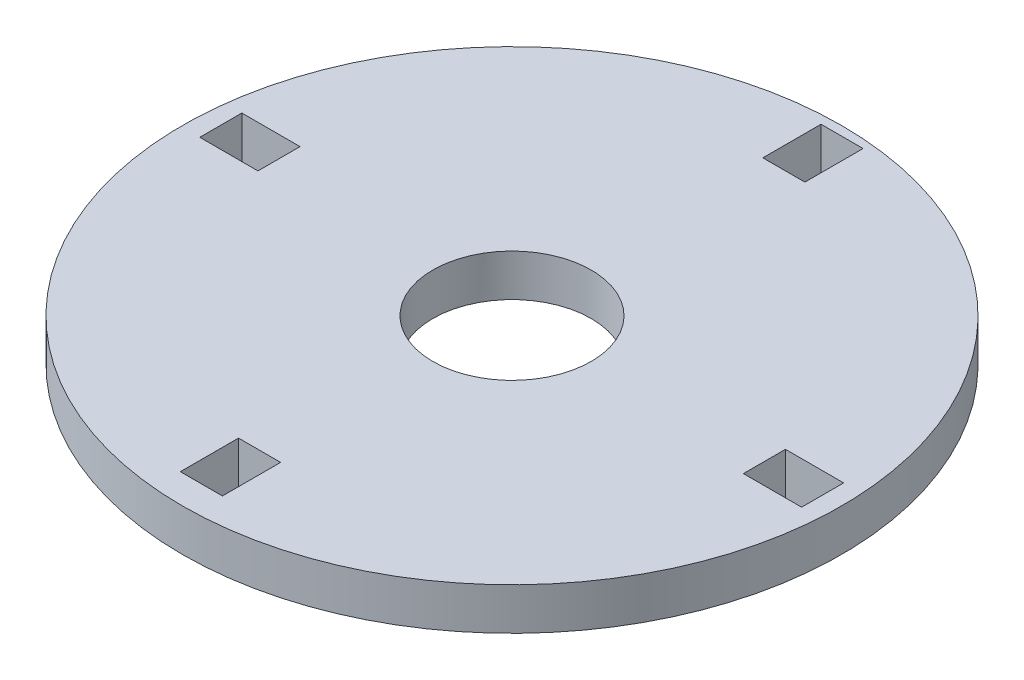
ISO-10303-21;
HEADER;
FILE_DESCRIPTION(('STEP AP214'),'2;1');
FILE_NAME('part.step','',(''),(''),'','','');
FILE_SCHEMA(('AUTOMOTIVE_DESIGN { 1 0 10303 214 1 1 1 1 }'));
ENDSEC;
DATA;
#1=APPLICATION_CONTEXT('core data for automotive mechanical design processes');
#2=APPLICATION_PROTOCOL_DEFINITION('international standard','automotive_design',2000,#1);
#3=PRODUCT_CONTEXT('',#1,'mechanical');
#4=PRODUCT('Part','Part','',(#3));
#5=PRODUCT_RELATED_PRODUCT_CATEGORY('part','',(#4));
#6=PRODUCT_DEFINITION_FORMATION('','',#4);
#7=PRODUCT_DEFINITION_CONTEXT('part definition',#1,'design');
#8=PRODUCT_DEFINITION('design','',#6,#7);
#9=PRODUCT_DEFINITION_SHAPE('','',#8);
#10=(LENGTH_UNIT() NAMED_UNIT(*) SI_UNIT(.MILLI.,.METRE.));
#11=(NAMED_UNIT(*) PLANE_ANGLE_UNIT() SI_UNIT($,.RADIAN.));
#12=(NAMED_UNIT(*) SI_UNIT($,.STERADIAN.) SOLID_ANGLE_UNIT());
#13=UNCERTAINTY_MEASURE_WITH_UNIT(LENGTH_MEASURE(1.E-05),#10,'distance_accuracy_value','');
#14=(GEOMETRIC_REPRESENTATION_CONTEXT(3) GLOBAL_UNCERTAINTY_ASSIGNED_CONTEXT((#13)) GLOBAL_UNIT_ASSIGNED_CONTEXT((#10,
#11,#12)) REPRESENTATION_CONTEXT('',''));
#15=CARTESIAN_POINT('',(0.,0.,0.));
#16=DIRECTION('',(0.,0.,1.));
#17=DIRECTION('',(1.,0.,0.));
#18=AXIS2_PLACEMENT_3D('',#15,#16,#17);
#19=CARTESIAN_POINT('',(0.,-3.,0.));
#20=DIRECTION('',(0.,1.,0.));
#21=DIRECTION('',(0.,0.,1.));
#22=AXIS2_PLACEMENT_3D('',#19,#20,#21);
#23=CYLINDRICAL_SURFACE('',#22,23.5);
#24=CARTESIAN_POINT('',(0.,-3.,0.));
#25=DIRECTION('',(0.,-1.,0.));
#26=DIRECTION('',(0.,0.,-1.));
#27=AXIS2_PLACEMENT_3D('',#24,#25,#26);
#28=CIRCLE('',#27,23.5);
#29=CARTESIAN_POINT('',(0.,-3.,-23.5));
#30=VERTEX_POINT('',#29);
#31=EDGE_CURVE('E11',#30,#30,#28,.T.);
#32=ORIENTED_EDGE('',*,*,#31,.F.);
#33=EDGE_LOOP('',(#32));
#34=FACE_BOUND('',#33,.T.);
#35=CARTESIAN_POINT('',(0.,0.,0.));
#36=DIRECTION('',(0.,-1.,0.));
#37=DIRECTION('',(0.,0.,-1.));
#38=AXIS2_PLACEMENT_3D('',#35,#36,#37);
#39=CIRCLE('',#38,23.5);
#40=CARTESIAN_POINT('',(0.,0.,-23.5));
#41=VERTEX_POINT('',#40);
#42=EDGE_CURVE('E36',#41,#41,#39,.T.);
#43=ORIENTED_EDGE('',*,*,#42,.T.);
#44=EDGE_LOOP('',(#43));
#45=FACE_BOUND('',#44,.T.);
#46=ADVANCED_FACE('F33',(#34,#45),#23,.T.);
#47=CARTESIAN_POINT('',(0.,-3.,0.));
#48=DIRECTION('',(0.,-1.,0.));
#49=DIRECTION('',(0.,0.,-1.));
#50=AXIS2_PLACEMENT_3D('',#47,#48,#49);
#51=PLANE('',#50);
#52=DIRECTION('',(0.,0.,-1.));
#53=VECTOR('',#52,1.);
#54=CARTESIAN_POINT('',(22.15,-3.,1.5));
#55=LINE('',#54,#53);
#56=CARTESIAN_POINT('',(22.15,-3.,1.5));
#57=VERTEX_POINT('',#56);
#58=CARTESIAN_POINT('',(22.15,-3.,-1.5));
#59=VERTEX_POINT('',#58);
#60=EDGE_CURVE('E149',#57,#59,#55,.T.);
#61=ORIENTED_EDGE('',*,*,#60,.T.);
#62=DIRECTION('',(-1.,0.,0.));
#63=VECTOR('',#62,1.);
#64=CARTESIAN_POINT('',(18.,-3.,-1.5));
#65=LINE('',#64,#63);
#66=CARTESIAN_POINT('',(18.,-3.,-1.5));
#67=VERTEX_POINT('',#66);
#68=EDGE_CURVE('E160',#59,#67,#65,.T.);
#69=ORIENTED_EDGE('',*,*,#68,.T.);
#70=DIRECTION('',(0.,0.,1.));
#71=VECTOR('',#70,1.);
#72=CARTESIAN_POINT('',(18.,-3.,1.5));
#73=LINE('',#72,#71);
#74=CARTESIAN_POINT('',(18.,-3.,1.5));
#75=VERTEX_POINT('',#74);
#76=EDGE_CURVE('E47',#67,#75,#73,.T.);
#77=ORIENTED_EDGE('',*,*,#76,.T.);
#78=DIRECTION('',(1.,0.,0.));
#79=VECTOR('',#78,1.);
#80=CARTESIAN_POINT('',(18.,-3.,1.5));
#81=LINE('',#80,#79);
#82=EDGE_CURVE('E157',#75,#57,#81,.T.);
#83=ORIENTED_EDGE('',*,*,#82,.T.);
#84=EDGE_LOOP('',(#61,#69,#77,#83));
#85=FACE_BOUND('',#84,.T.);
#86=DIRECTION('',(0.,0.,-1.));
#87=VECTOR('',#86,1.);
#88=CARTESIAN_POINT('',(0.807365875161481,-3.,17.3073658751614));
#89=LINE('',#88,#87);
#90=CARTESIAN_POINT('',(0.807365875161481,-3.,21.4573658751614));
#91=VERTEX_POINT('',#90);
#92=CARTESIAN_POINT('',(0.807365875161481,-3.,17.3073658751614));
#93=VERTEX_POINT('',#92);
#94=EDGE_CURVE('E187',#91,#93,#89,.T.);
#95=ORIENTED_EDGE('',*,*,#94,.T.);
#96=DIRECTION('',(-1.,0.,0.));
#97=VECTOR('',#96,1.);
#98=CARTESIAN_POINT('',(-2.19263412483852,-3.,17.3073658751614));
#99=LINE('',#98,#97);
#100=CARTESIAN_POINT('',(-2.19263412483852,-3.,17.3073658751614));
#101=VERTEX_POINT('',#100);
#102=EDGE_CURVE('E190',#93,#101,#99,.T.);
#103=ORIENTED_EDGE('',*,*,#102,.T.);
#104=DIRECTION('',(0.,0.,1.));
#105=VECTOR('',#104,1.);
#106=CARTESIAN_POINT('',(-2.19263412483852,-3.,17.3073658751614));
#107=LINE('',#106,#105);
#108=CARTESIAN_POINT('',(-2.19263412483852,-3.,21.4573658751614));
#109=VERTEX_POINT('',#108);
#110=EDGE_CURVE('E55',#101,#109,#107,.T.);
#111=ORIENTED_EDGE('',*,*,#110,.T.);
#112=DIRECTION('',(1.,0.,0.));
#113=VECTOR('',#112,1.);
#114=CARTESIAN_POINT('',(-2.19263412483852,-3.,21.4573658751614));
#115=LINE('',#114,#113);
#116=EDGE_CURVE('E195',#109,#91,#115,.T.);
#117=ORIENTED_EDGE('',*,*,#116,.T.);
#118=EDGE_LOOP('',(#95,#103,#111,#117));
#119=FACE_BOUND('',#118,.T.);
#120=DIRECTION('',(1.,0.,0.));
#121=VECTOR('',#120,1.);
#122=CARTESIAN_POINT('',(-17.9999999999999,-3.,0.114731750322837));
#123=LINE('',#122,#121);
#124=CARTESIAN_POINT('',(-22.1499999999999,-3.,0.114731750322838));
#125=VERTEX_POINT('',#124);
#126=CARTESIAN_POINT('',(-17.9999999999999,-3.,0.114731750322837));
#127=VERTEX_POINT('',#126);
#128=EDGE_CURVE('E217',#125,#127,#123,.T.);
#129=ORIENTED_EDGE('',*,*,#128,.T.);
#130=DIRECTION('',(0.,0.,-1.));
#131=VECTOR('',#130,1.);
#132=CARTESIAN_POINT('',(-17.9999999999999,-3.,-2.88526824967716));
#133=LINE('',#132,#131);
#134=CARTESIAN_POINT('',(-17.9999999999999,-3.,-2.88526824967716));
#135=VERTEX_POINT('',#134);
#136=EDGE_CURVE('E220',#127,#135,#133,.T.);
#137=ORIENTED_EDGE('',*,*,#136,.T.);
#138=DIRECTION('',(-1.,0.,0.));
#139=VECTOR('',#138,1.);
#140=CARTESIAN_POINT('',(-17.9999999999999,-3.,-2.88526824967716));
#141=LINE('',#140,#139);
#142=CARTESIAN_POINT('',(-22.1499999999999,-3.,-2.88526824967716));
#143=VERTEX_POINT('',#142);
#144=EDGE_CURVE('E224',#135,#143,#141,.T.);
#145=ORIENTED_EDGE('',*,*,#144,.T.);
#146=DIRECTION('',(0.,0.,1.));
#147=VECTOR('',#146,1.);
#148=CARTESIAN_POINT('',(-22.1499999999999,-3.,-2.88526824967716));
#149=LINE('',#148,#147);
#150=EDGE_CURVE('E227',#143,#125,#149,.T.);
#151=ORIENTED_EDGE('',*,*,#150,.T.);
#152=EDGE_LOOP('',(#129,#137,#145,#151));
#153=FACE_BOUND('',#152,.T.);
#154=DIRECTION('',(0.,0.,1.));
#155=VECTOR('',#154,1.);
#156=CARTESIAN_POINT('',(-0.807365875161359,-3.,-18.6926341248385));
#157=LINE('',#156,#155);
#158=CARTESIAN_POINT('',(-0.80736587516136,-3.,-22.8426341248385));
#159=VERTEX_POINT('',#158);
#160=CARTESIAN_POINT('',(-0.807365875161359,-3.,-18.6926341248385));
#161=VERTEX_POINT('',#160);
#162=EDGE_CURVE('E249',#159,#161,#157,.T.);
#163=ORIENTED_EDGE('',*,*,#162,.T.);
#164=DIRECTION('',(1.,0.,0.));
#165=VECTOR('',#164,1.);
#166=CARTESIAN_POINT('',(2.19263412483864,-3.,-18.6926341248385));
#167=LINE('',#166,#165);
#168=CARTESIAN_POINT('',(2.19263412483864,-3.,-18.6926341248385));
#169=VERTEX_POINT('',#168);
#170=EDGE_CURVE('E252',#161,#169,#167,.T.);
#171=ORIENTED_EDGE('',*,*,#170,.T.);
#172=DIRECTION('',(0.,0.,-1.));
#173=VECTOR('',#172,1.);
#174=CARTESIAN_POINT('',(2.19263412483864,-3.,-18.6926341248385));
#175=LINE('',#174,#173);
#176=CARTESIAN_POINT('',(2.19263412483864,-3.,-22.8426341248385));
#177=VERTEX_POINT('',#176);
#178=EDGE_CURVE('E256',#169,#177,#175,.T.);
#179=ORIENTED_EDGE('',*,*,#178,.T.);
#180=DIRECTION('',(-1.,0.,0.));
#181=VECTOR('',#180,1.);
#182=CARTESIAN_POINT('',(2.19263412483864,-3.,-22.8426341248385));
#183=LINE('',#182,#181);
#184=EDGE_CURVE('E259',#177,#159,#183,.T.);
#185=ORIENTED_EDGE('',*,*,#184,.T.);
#186=EDGE_LOOP('',(#163,#171,#179,#185));
#187=FACE_BOUND('',#186,.T.);
#188=CARTESIAN_POINT('',(0.,-3.,0.));
#189=DIRECTION('',(0.,-1.,0.));
#190=DIRECTION('',(0.,0.,-1.));
#191=AXIS2_PLACEMENT_3D('',#188,#189,#190);
#192=CIRCLE('',#191,5.65);
#193=CARTESIAN_POINT('',(0.,-3.,-5.65));
#194=VERTEX_POINT('',#193);
#195=EDGE_CURVE('E282',#194,#194,#192,.T.);
#196=ORIENTED_EDGE('',*,*,#195,.F.);
#197=EDGE_LOOP('',(#196));
#198=FACE_BOUND('',#197,.T.);
#199=ORIENTED_EDGE('',*,*,#31,.T.);
#200=EDGE_LOOP('',(#199));
#201=FACE_BOUND('',#200,.T.);
#202=ADVANCED_FACE('F164',(#85,#119,#153,#187,#198,#201),#51,.T.);
#203=CARTESIAN_POINT('',(0.,0.,0.));
#204=DIRECTION('',(0.,-1.,0.));
#205=DIRECTION('',(0.,0.,-1.));
#206=AXIS2_PLACEMENT_3D('',#203,#204,#205);
#207=PLANE('',#206);
#208=DIRECTION('',(-1.,0.,0.));
#209=VECTOR('',#208,1.);
#210=CARTESIAN_POINT('',(18.,0.,-1.5));
#211=LINE('',#210,#209);
#212=CARTESIAN_POINT('',(22.15,0.,-1.5));
#213=VERTEX_POINT('',#212);
#214=CARTESIAN_POINT('',(18.,0.,-1.5));
#215=VERTEX_POINT('',#214);
#216=EDGE_CURVE('E176',#213,#215,#211,.T.);
#217=ORIENTED_EDGE('',*,*,#216,.F.);
#218=DIRECTION('',(0.,0.,-1.));
#219=VECTOR('',#218,1.);
#220=CARTESIAN_POINT('',(22.15,0.,1.5));
#221=LINE('',#220,#219);
#222=CARTESIAN_POINT('',(22.15,0.,1.5));
#223=VERTEX_POINT('',#222);
#224=EDGE_CURVE('E152',#223,#213,#221,.T.);
#225=ORIENTED_EDGE('',*,*,#224,.F.);
#226=DIRECTION('',(1.,0.,0.));
#227=VECTOR('',#226,1.);
#228=CARTESIAN_POINT('',(18.,0.,1.5));
#229=LINE('',#228,#227);
#230=CARTESIAN_POINT('',(18.,0.,1.5));
#231=VERTEX_POINT('',#230);
#232=EDGE_CURVE('E167',#231,#223,#229,.T.);
#233=ORIENTED_EDGE('',*,*,#232,.F.);
#234=DIRECTION('',(0.,0.,1.));
#235=VECTOR('',#234,1.);
#236=CARTESIAN_POINT('',(18.,0.,1.5));
#237=LINE('',#236,#235);
#238=EDGE_CURVE('E170',#215,#231,#237,.T.);
#239=ORIENTED_EDGE('',*,*,#238,.F.);
#240=EDGE_LOOP('',(#217,#225,#233,#239));
#241=FACE_BOUND('',#240,.T.);
#242=DIRECTION('',(-1.,0.,0.));
#243=VECTOR('',#242,1.);
#244=CARTESIAN_POINT('',(-2.19263412483852,0.,17.3073658751614));
#245=LINE('',#244,#243);
#246=CARTESIAN_POINT('',(0.807365875161481,0.,17.3073658751614));
#247=VERTEX_POINT('',#246);
#248=CARTESIAN_POINT('',(-2.19263412483852,0.,17.3073658751614));
#249=VERTEX_POINT('',#248);
#250=EDGE_CURVE('E201',#247,#249,#245,.T.);
#251=ORIENTED_EDGE('',*,*,#250,.F.);
#252=DIRECTION('',(0.,0.,-1.));
#253=VECTOR('',#252,1.);
#254=CARTESIAN_POINT('',(0.807365875161481,0.,17.3073658751614));
#255=LINE('',#254,#253);
#256=CARTESIAN_POINT('',(0.807365875161481,0.,21.4573658751614));
#257=VERTEX_POINT('',#256);
#258=EDGE_CURVE('E199',#257,#247,#255,.T.);
#259=ORIENTED_EDGE('',*,*,#258,.F.);
#260=DIRECTION('',(1.,0.,0.));
#261=VECTOR('',#260,1.);
#262=CARTESIAN_POINT('',(-2.19263412483852,0.,21.4573658751614));
#263=LINE('',#262,#261);
#264=CARTESIAN_POINT('',(-2.19263412483852,0.,21.4573658751614));
#265=VERTEX_POINT('',#264);
#266=EDGE_CURVE('E191',#265,#257,#263,.T.);
#267=ORIENTED_EDGE('',*,*,#266,.F.);
#268=DIRECTION('',(0.,0.,1.));
#269=VECTOR('',#268,1.);
#270=CARTESIAN_POINT('',(-2.19263412483852,0.,17.3073658751614));
#271=LINE('',#270,#269);
#272=EDGE_CURVE('E205',#249,#265,#271,.T.);
#273=ORIENTED_EDGE('',*,*,#272,.F.);
#274=EDGE_LOOP('',(#251,#259,#267,#273));
#275=FACE_BOUND('',#274,.T.);
#276=DIRECTION('',(0.,0.,-1.));
#277=VECTOR('',#276,1.);
#278=CARTESIAN_POINT('',(-17.9999999999999,0.,-2.88526824967716));
#279=LINE('',#278,#277);
#280=CARTESIAN_POINT('',(-17.9999999999999,0.,0.114731750322837));
#281=VERTEX_POINT('',#280);
#282=CARTESIAN_POINT('',(-17.9999999999999,0.,-2.88526824967716));
#283=VERTEX_POINT('',#282);
#284=EDGE_CURVE('E233',#281,#283,#279,.T.);
#285=ORIENTED_EDGE('',*,*,#284,.F.);
#286=DIRECTION('',(1.,0.,0.));
#287=VECTOR('',#286,1.);
#288=CARTESIAN_POINT('',(-17.9999999999999,0.,0.114731750322837));
#289=LINE('',#288,#287);
#290=CARTESIAN_POINT('',(-22.1499999999999,0.,0.114731750322838));
#291=VERTEX_POINT('',#290);
#292=EDGE_CURVE('E231',#291,#281,#289,.T.);
#293=ORIENTED_EDGE('',*,*,#292,.F.);
#294=DIRECTION('',(0.,0.,1.));
#295=VECTOR('',#294,1.);
#296=CARTESIAN_POINT('',(-22.1499999999999,0.,-2.88526824967716));
#297=LINE('',#296,#295);
#298=CARTESIAN_POINT('',(-22.1499999999999,0.,-2.88526824967716));
#299=VERTEX_POINT('',#298);
#300=EDGE_CURVE('E221',#299,#291,#297,.T.);
#301=ORIENTED_EDGE('',*,*,#300,.F.);
#302=DIRECTION('',(-1.,0.,0.));
#303=VECTOR('',#302,1.);
#304=CARTESIAN_POINT('',(-17.9999999999999,0.,-2.88526824967716));
#305=LINE('',#304,#303);
#306=EDGE_CURVE('E237',#283,#299,#305,.T.);
#307=ORIENTED_EDGE('',*,*,#306,.F.);
#308=EDGE_LOOP('',(#285,#293,#301,#307));
#309=FACE_BOUND('',#308,.T.);
#310=DIRECTION('',(1.,0.,0.));
#311=VECTOR('',#310,1.);
#312=CARTESIAN_POINT('',(2.19263412483864,0.,-18.6926341248385));
#313=LINE('',#312,#311);
#314=CARTESIAN_POINT('',(-0.807365875161359,0.,-18.6926341248385));
#315=VERTEX_POINT('',#314);
#316=CARTESIAN_POINT('',(2.19263412483864,0.,-18.6926341248385));
#317=VERTEX_POINT('',#316);
#318=EDGE_CURVE('E265',#315,#317,#313,.T.);
#319=ORIENTED_EDGE('',*,*,#318,.F.);
#320=DIRECTION('',(0.,0.,1.));
#321=VECTOR('',#320,1.);
#322=CARTESIAN_POINT('',(-0.807365875161359,0.,-18.6926341248385));
#323=LINE('',#322,#321);
#324=CARTESIAN_POINT('',(-0.80736587516136,0.,-22.8426341248385));
#325=VERTEX_POINT('',#324);
#326=EDGE_CURVE('E263',#325,#315,#323,.T.);
#327=ORIENTED_EDGE('',*,*,#326,.F.);
#328=DIRECTION('',(-1.,0.,0.));
#329=VECTOR('',#328,1.);
#330=CARTESIAN_POINT('',(2.19263412483864,0.,-22.8426341248385));
#331=LINE('',#330,#329);
#332=CARTESIAN_POINT('',(2.19263412483864,0.,-22.8426341248385));
#333=VERTEX_POINT('',#332);
#334=EDGE_CURVE('E253',#333,#325,#331,.T.);
#335=ORIENTED_EDGE('',*,*,#334,.F.);
#336=DIRECTION('',(0.,0.,-1.));
#337=VECTOR('',#336,1.);
#338=CARTESIAN_POINT('',(2.19263412483864,0.,-18.6926341248385));
#339=LINE('',#338,#337);
#340=EDGE_CURVE('E268',#317,#333,#339,.T.);
#341=ORIENTED_EDGE('',*,*,#340,.F.);
#342=EDGE_LOOP('',(#319,#327,#335,#341));
#343=FACE_BOUND('',#342,.T.);
#344=CARTESIAN_POINT('',(0.,0.,0.));
#345=DIRECTION('',(0.,1.,0.));
#346=DIRECTION('',(0.,0.,1.));
#347=AXIS2_PLACEMENT_3D('',#344,#345,#346);
#348=CIRCLE('',#347,5.65);
#349=CARTESIAN_POINT('',(0.,0.,5.65));
#350=VERTEX_POINT('',#349);
#351=EDGE_CURVE('E183',#350,#350,#348,.T.);
#352=ORIENTED_EDGE('',*,*,#351,.F.);
#353=EDGE_LOOP('',(#352));
#354=FACE_BOUND('',#353,.T.);
#355=ORIENTED_EDGE('',*,*,#42,.F.);
#356=EDGE_LOOP('',(#355));
#357=FACE_BOUND('',#356,.T.);
#358=ADVANCED_FACE('F290',(#241,#275,#309,#343,#354,#357),#207,.F.);
#359=CARTESIAN_POINT('',(0.,-10.,0.));
#360=DIRECTION('',(0.,1.,0.));
#361=DIRECTION('',(0.,0.,1.));
#362=AXIS2_PLACEMENT_3D('',#359,#360,#361);
#363=CYLINDRICAL_SURFACE('',#362,5.65);
#364=ORIENTED_EDGE('',*,*,#195,.T.);
#365=EDGE_LOOP('',(#364));
#366=FACE_BOUND('',#365,.T.);
#367=ORIENTED_EDGE('',*,*,#351,.T.);
#368=EDGE_LOOP('',(#367));
#369=FACE_BOUND('',#368,.T.);
#370=ADVANCED_FACE('F292',(#366,#369),#363,.F.);
#371=CARTESIAN_POINT('',(-0.807365875161359,-3.,-18.6926341248385));
#372=DIRECTION('',(-1.,0.,0.));
#373=DIRECTION('',(0.,0.,1.));
#374=AXIS2_PLACEMENT_3D('',#371,#372,#373);
#375=PLANE('',#374);
#376=ORIENTED_EDGE('',*,*,#326,.T.);
#377=DIRECTION('',(0.,1.,0.));
#378=VECTOR('',#377,1.);
#379=CARTESIAN_POINT('',(-0.807365875161359,-3.,-18.6926341248385));
#380=LINE('',#379,#378);
#381=EDGE_CURVE('E262',#161,#315,#380,.T.);
#382=ORIENTED_EDGE('',*,*,#381,.F.);
#383=ORIENTED_EDGE('',*,*,#162,.F.);
#384=DIRECTION('',(0.,1.,0.));
#385=VECTOR('',#384,1.);
#386=CARTESIAN_POINT('',(-0.80736587516136,-3.,-22.8426341248385));
#387=LINE('',#386,#385);
#388=EDGE_CURVE('E234',#159,#325,#387,.T.);
#389=ORIENTED_EDGE('',*,*,#388,.T.);
#390=EDGE_LOOP('',(#376,#382,#383,#389));
#391=FACE_BOUND('',#390,.T.);
#392=ADVANCED_FACE('F298',(#391),#375,.F.);
#393=CARTESIAN_POINT('',(2.19263412483864,-3.,-22.8426341248385));
#394=DIRECTION('',(0.,0.,-1.));
#395=DIRECTION('',(-1.,0.,0.));
#396=AXIS2_PLACEMENT_3D('',#393,#394,#395);
#397=PLANE('',#396);
#398=ORIENTED_EDGE('',*,*,#334,.T.);
#399=ORIENTED_EDGE('',*,*,#388,.F.);
#400=ORIENTED_EDGE('',*,*,#184,.F.);
#401=DIRECTION('',(0.,1.,0.));
#402=VECTOR('',#401,1.);
#403=CARTESIAN_POINT('',(2.19263412483864,-3.,-22.8426341248385));
#404=LINE('',#403,#402);
#405=EDGE_CURVE('E274',#177,#333,#404,.T.);
#406=ORIENTED_EDGE('',*,*,#405,.T.);
#407=EDGE_LOOP('',(#398,#399,#400,#406));
#408=FACE_BOUND('',#407,.T.);
#409=ADVANCED_FACE('F329',(#408),#397,.F.);
#410=CARTESIAN_POINT('',(2.19263412483864,-3.,-18.6926341248385));
#411=DIRECTION('',(1.,0.,0.));
#412=DIRECTION('',(0.,0.,-1.));
#413=AXIS2_PLACEMENT_3D('',#410,#411,#412);
#414=PLANE('',#413);
#415=ORIENTED_EDGE('',*,*,#340,.T.);
#416=ORIENTED_EDGE('',*,*,#405,.F.);
#417=ORIENTED_EDGE('',*,*,#178,.F.);
#418=DIRECTION('',(0.,1.,0.));
#419=VECTOR('',#418,1.);
#420=CARTESIAN_POINT('',(2.19263412483864,-3.,-18.6926341248385));
#421=LINE('',#420,#419);
#422=EDGE_CURVE('E276',#169,#317,#421,.T.);
#423=ORIENTED_EDGE('',*,*,#422,.T.);
#424=EDGE_LOOP('',(#415,#416,#417,#423));
#425=FACE_BOUND('',#424,.T.);
#426=ADVANCED_FACE('F339',(#425),#414,.F.);
#427=CARTESIAN_POINT('',(2.19263412483864,-3.,-18.6926341248385));
#428=DIRECTION('',(0.,0.,1.));
#429=DIRECTION('',(1.,0.,0.));
#430=AXIS2_PLACEMENT_3D('',#427,#428,#429);
#431=PLANE('',#430);
#432=ORIENTED_EDGE('',*,*,#318,.T.);
#433=ORIENTED_EDGE('',*,*,#422,.F.);
#434=ORIENTED_EDGE('',*,*,#170,.F.);
#435=ORIENTED_EDGE('',*,*,#381,.T.);
#436=EDGE_LOOP('',(#432,#433,#434,#435));
#437=FACE_BOUND('',#436,.T.);
#438=ADVANCED_FACE('F349',(#437),#431,.F.);
#439=CARTESIAN_POINT('',(-17.9999999999999,-3.,0.114731750322837));
#440=DIRECTION('',(0.,0.,1.));
#441=DIRECTION('',(1.,0.,0.));
#442=AXIS2_PLACEMENT_3D('',#439,#440,#441);
#443=PLANE('',#442);
#444=ORIENTED_EDGE('',*,*,#292,.T.);
#445=DIRECTION('',(0.,1.,0.));
#446=VECTOR('',#445,1.);
#447=CARTESIAN_POINT('',(-17.9999999999999,-3.,0.114731750322837));
#448=LINE('',#447,#446);
#449=EDGE_CURVE('E230',#127,#281,#448,.T.);
#450=ORIENTED_EDGE('',*,*,#449,.F.);
#451=ORIENTED_EDGE('',*,*,#128,.F.);
#452=DIRECTION('',(0.,1.,0.));
#453=VECTOR('',#452,1.);
#454=CARTESIAN_POINT('',(-22.1499999999999,-3.,0.114731750322838));
#455=LINE('',#454,#453);
#456=EDGE_CURVE('E202',#125,#291,#455,.T.);
#457=ORIENTED_EDGE('',*,*,#456,.T.);
#458=EDGE_LOOP('',(#444,#450,#451,#457));
#459=FACE_BOUND('',#458,.T.);
#460=ADVANCED_FACE('F359',(#459),#443,.F.);
#461=CARTESIAN_POINT('',(-22.1499999999999,-3.,-2.88526824967716));
#462=DIRECTION('',(-1.,0.,0.));
#463=DIRECTION('',(0.,0.,1.));
#464=AXIS2_PLACEMENT_3D('',#461,#462,#463);
#465=PLANE('',#464);
#466=ORIENTED_EDGE('',*,*,#300,.T.);
#467=ORIENTED_EDGE('',*,*,#456,.F.);
#468=ORIENTED_EDGE('',*,*,#150,.F.);
#469=DIRECTION('',(0.,1.,0.));
#470=VECTOR('',#469,1.);
#471=CARTESIAN_POINT('',(-22.1499999999999,-3.,-2.88526824967716));
#472=LINE('',#471,#470);
#473=EDGE_CURVE('E243',#143,#299,#472,.T.);
#474=ORIENTED_EDGE('',*,*,#473,.T.);
#475=EDGE_LOOP('',(#466,#467,#468,#474));
#476=FACE_BOUND('',#475,.T.);
#477=ADVANCED_FACE('F369',(#476),#465,.F.);
#478=CARTESIAN_POINT('',(-17.9999999999999,-3.,-2.88526824967716));
#479=DIRECTION('',(0.,0.,-1.));
#480=DIRECTION('',(-1.,0.,0.));
#481=AXIS2_PLACEMENT_3D('',#478,#479,#480);
#482=PLANE('',#481);
#483=ORIENTED_EDGE('',*,*,#306,.T.);
#484=ORIENTED_EDGE('',*,*,#473,.F.);
#485=ORIENTED_EDGE('',*,*,#144,.F.);
#486=DIRECTION('',(0.,1.,0.));
#487=VECTOR('',#486,1.);
#488=CARTESIAN_POINT('',(-17.9999999999999,-3.,-2.88526824967716));
#489=LINE('',#488,#487);
#490=EDGE_CURVE('E245',#135,#283,#489,.T.);
#491=ORIENTED_EDGE('',*,*,#490,.T.);
#492=EDGE_LOOP('',(#483,#484,#485,#491));
#493=FACE_BOUND('',#492,.T.);
#494=ADVANCED_FACE('F379',(#493),#482,.F.);
#495=CARTESIAN_POINT('',(-17.9999999999999,-3.,-2.88526824967716));
#496=DIRECTION('',(1.,0.,0.));
#497=DIRECTION('',(0.,0.,-1.));
#498=AXIS2_PLACEMENT_3D('',#495,#496,#497);
#499=PLANE('',#498);
#500=ORIENTED_EDGE('',*,*,#284,.T.);
#501=ORIENTED_EDGE('',*,*,#490,.F.);
#502=ORIENTED_EDGE('',*,*,#136,.F.);
#503=ORIENTED_EDGE('',*,*,#449,.T.);
#504=EDGE_LOOP('',(#500,#501,#502,#503));
#505=FACE_BOUND('',#504,.T.);
#506=ADVANCED_FACE('F389',(#505),#499,.F.);
#507=CARTESIAN_POINT('',(0.807365875161481,-3.,17.3073658751614));
#508=DIRECTION('',(1.,0.,0.));
#509=DIRECTION('',(0.,0.,-1.));
#510=AXIS2_PLACEMENT_3D('',#507,#508,#509);
#511=PLANE('',#510);
#512=ORIENTED_EDGE('',*,*,#258,.T.);
#513=DIRECTION('',(0.,1.,0.));
#514=VECTOR('',#513,1.);
#515=CARTESIAN_POINT('',(0.807365875161481,-3.,17.3073658751614));
#516=LINE('',#515,#514);
#517=EDGE_CURVE('E198',#93,#247,#516,.T.);
#518=ORIENTED_EDGE('',*,*,#517,.F.);
#519=ORIENTED_EDGE('',*,*,#94,.F.);
#520=DIRECTION('',(0.,1.,0.));
#521=VECTOR('',#520,1.);
#522=CARTESIAN_POINT('',(0.807365875161481,-3.,21.4573658751614));
#523=LINE('',#522,#521);
#524=EDGE_CURVE('E177',#91,#257,#523,.T.);
#525=ORIENTED_EDGE('',*,*,#524,.T.);
#526=EDGE_LOOP('',(#512,#518,#519,#525));
#527=FACE_BOUND('',#526,.T.);
#528=ADVANCED_FACE('F399',(#527),#511,.F.);
#529=CARTESIAN_POINT('',(-2.19263412483852,-3.,21.4573658751614));
#530=DIRECTION('',(0.,0.,1.));
#531=DIRECTION('',(1.,0.,0.));
#532=AXIS2_PLACEMENT_3D('',#529,#530,#531);
#533=PLANE('',#532);
#534=ORIENTED_EDGE('',*,*,#266,.T.);
#535=ORIENTED_EDGE('',*,*,#524,.F.);
#536=ORIENTED_EDGE('',*,*,#116,.F.);
#537=DIRECTION('',(0.,1.,0.));
#538=VECTOR('',#537,1.);
#539=CARTESIAN_POINT('',(-2.19263412483852,-3.,21.4573658751614));
#540=LINE('',#539,#538);
#541=EDGE_CURVE('E211',#109,#265,#540,.T.);
#542=ORIENTED_EDGE('',*,*,#541,.T.);
#543=EDGE_LOOP('',(#534,#535,#536,#542));
#544=FACE_BOUND('',#543,.T.);
#545=ADVANCED_FACE('F409',(#544),#533,.F.);
#546=CARTESIAN_POINT('',(-2.19263412483852,-3.,17.3073658751614));
#547=DIRECTION('',(-1.,0.,0.));
#548=DIRECTION('',(0.,0.,1.));
#549=AXIS2_PLACEMENT_3D('',#546,#547,#548);
#550=PLANE('',#549);
#551=ORIENTED_EDGE('',*,*,#272,.T.);
#552=ORIENTED_EDGE('',*,*,#541,.F.);
#553=ORIENTED_EDGE('',*,*,#110,.F.);
#554=DIRECTION('',(0.,1.,0.));
#555=VECTOR('',#554,1.);
#556=CARTESIAN_POINT('',(-2.19263412483852,-3.,17.3073658751614));
#557=LINE('',#556,#555);
#558=EDGE_CURVE('E213',#101,#249,#557,.T.);
#559=ORIENTED_EDGE('',*,*,#558,.T.);
#560=EDGE_LOOP('',(#551,#552,#553,#559));
#561=FACE_BOUND('',#560,.T.);
#562=ADVANCED_FACE('F419',(#561),#550,.F.);
#563=CARTESIAN_POINT('',(-2.19263412483852,-3.,17.3073658751614));
#564=DIRECTION('',(0.,0.,-1.));
#565=DIRECTION('',(-1.,0.,0.));
#566=AXIS2_PLACEMENT_3D('',#563,#564,#565);
#567=PLANE('',#566);
#568=ORIENTED_EDGE('',*,*,#250,.T.);
#569=ORIENTED_EDGE('',*,*,#558,.F.);
#570=ORIENTED_EDGE('',*,*,#102,.F.);
#571=ORIENTED_EDGE('',*,*,#517,.T.);
#572=EDGE_LOOP('',(#568,#569,#570,#571));
#573=FACE_BOUND('',#572,.T.);
#574=ADVANCED_FACE('F429',(#573),#567,.F.);
#575=CARTESIAN_POINT('',(22.15,-3.,1.5));
#576=DIRECTION('',(1.,0.,0.));
#577=DIRECTION('',(0.,0.,-1.));
#578=AXIS2_PLACEMENT_3D('',#575,#576,#577);
#579=PLANE('',#578);
#580=ORIENTED_EDGE('',*,*,#224,.T.);
#581=DIRECTION('',(0.,1.,0.));
#582=VECTOR('',#581,1.);
#583=CARTESIAN_POINT('',(22.15,-3.,-1.5));
#584=LINE('',#583,#582);
#585=EDGE_CURVE('E145',#59,#213,#584,.T.);
#586=ORIENTED_EDGE('',*,*,#585,.F.);
#587=ORIENTED_EDGE('',*,*,#60,.F.);
#588=DIRECTION('',(0.,1.,0.));
#589=VECTOR('',#588,1.);
#590=CARTESIAN_POINT('',(22.15,-3.,1.5));
#591=LINE('',#590,#589);
#592=EDGE_CURVE('E181',#57,#223,#591,.T.);
#593=ORIENTED_EDGE('',*,*,#592,.T.);
#594=EDGE_LOOP('',(#580,#586,#587,#593));
#595=FACE_BOUND('',#594,.T.);
#596=ADVANCED_FACE('F147',(#595),#579,.F.);
#597=CARTESIAN_POINT('',(18.,-3.,1.5));
#598=DIRECTION('',(0.,0.,1.));
#599=DIRECTION('',(1.,0.,0.));
#600=AXIS2_PLACEMENT_3D('',#597,#598,#599);
#601=PLANE('',#600);
#602=ORIENTED_EDGE('',*,*,#232,.T.);
#603=ORIENTED_EDGE('',*,*,#592,.F.);
#604=ORIENTED_EDGE('',*,*,#82,.F.);
#605=DIRECTION('',(0.,1.,0.));
#606=VECTOR('',#605,1.);
#607=CARTESIAN_POINT('',(18.,-3.,1.5));
#608=LINE('',#607,#606);
#609=EDGE_CURVE('E184',#75,#231,#608,.T.);
#610=ORIENTED_EDGE('',*,*,#609,.T.);
#611=EDGE_LOOP('',(#602,#603,#604,#610));
#612=FACE_BOUND('',#611,.T.);
#613=ADVANCED_FACE('F447',(#612),#601,.F.);
#614=CARTESIAN_POINT('',(18.,-3.,1.5));
#615=DIRECTION('',(-1.,0.,0.));
#616=DIRECTION('',(0.,0.,1.));
#617=AXIS2_PLACEMENT_3D('',#614,#615,#616);
#618=PLANE('',#617);
#619=ORIENTED_EDGE('',*,*,#238,.T.);
#620=ORIENTED_EDGE('',*,*,#609,.F.);
#621=ORIENTED_EDGE('',*,*,#76,.F.);
#622=DIRECTION('',(0.,1.,0.));
#623=VECTOR('',#622,1.);
#624=CARTESIAN_POINT('',(18.,-3.,-1.5));
#625=LINE('',#624,#623);
#626=EDGE_CURVE('E156',#67,#215,#625,.T.);
#627=ORIENTED_EDGE('',*,*,#626,.T.);
#628=EDGE_LOOP('',(#619,#620,#621,#627));
#629=FACE_BOUND('',#628,.T.);
#630=ADVANCED_FACE('F456',(#629),#618,.F.);
#631=CARTESIAN_POINT('',(18.,-3.,-1.5));
#632=DIRECTION('',(0.,0.,-1.));
#633=DIRECTION('',(-1.,0.,0.));
#634=AXIS2_PLACEMENT_3D('',#631,#632,#633);
#635=PLANE('',#634);
#636=ORIENTED_EDGE('',*,*,#216,.T.);
#637=ORIENTED_EDGE('',*,*,#626,.F.);
#638=ORIENTED_EDGE('',*,*,#68,.F.);
#639=ORIENTED_EDGE('',*,*,#585,.T.);
#640=EDGE_LOOP('',(#636,#637,#638,#639));
#641=FACE_BOUND('',#640,.T.);
#642=ADVANCED_FACE('F161',(#641),#635,.F.);
#643=CLOSED_SHELL('',(#46,#202,#358,#370,#392,#409,#426,#438,#460,#477,#494,#506,#528,#545,#562,
#574,#596,#613,#630,#642));
#644=MANIFOLD_SOLID_BREP('B2',#643);
#645=ADVANCED_BREP_SHAPE_REPRESENTATION('',(#18,#644),#14);
#646=SHAPE_DEFINITION_REPRESENTATION(#9,#645);
ENDSEC;
END-ISO-10303-21;
